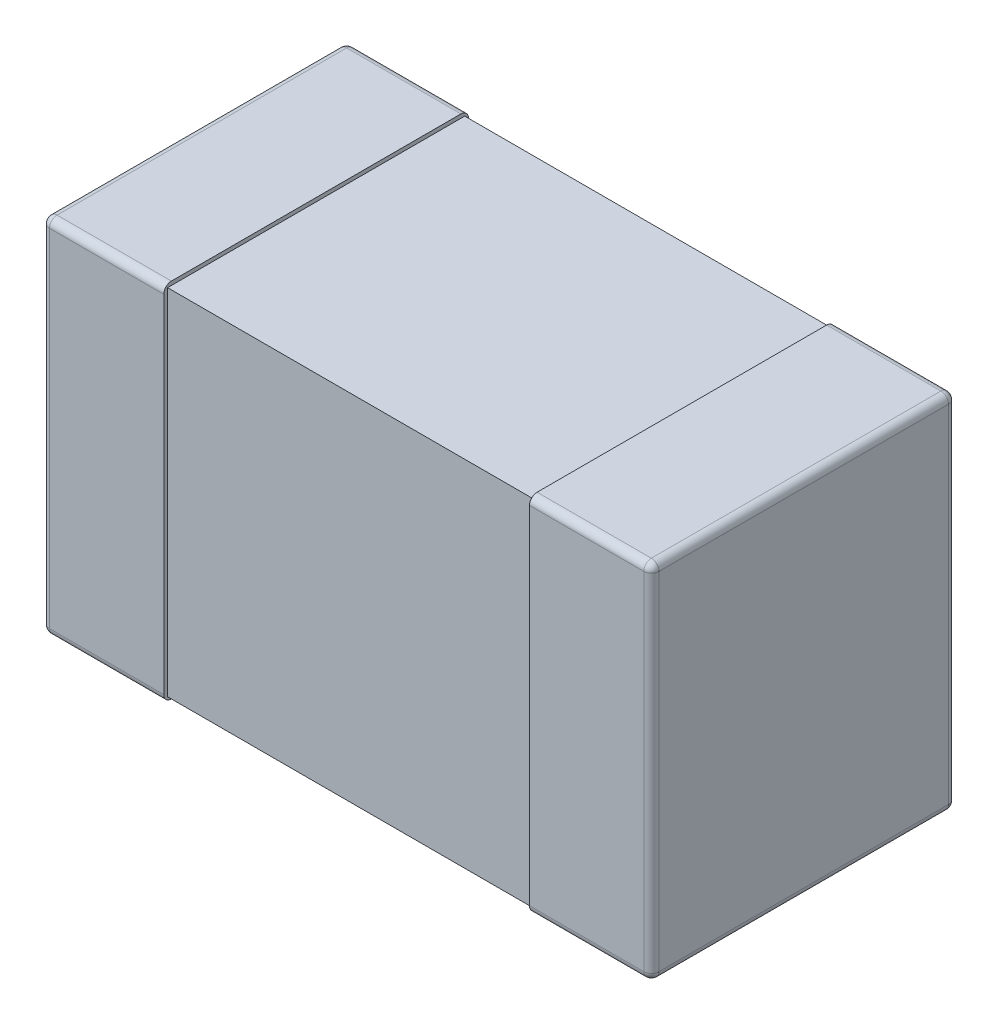
ISO-10303-21;
HEADER;
FILE_DESCRIPTION(('STEP AP214'),'2;1');
FILE_NAME('part.step','',(''),(''),'','','');
FILE_SCHEMA(('AUTOMOTIVE_DESIGN { 1 0 10303 214 1 1 1 1 }'));
ENDSEC;
DATA;
#1=APPLICATION_CONTEXT('core data for automotive mechanical design processes');
#2=APPLICATION_PROTOCOL_DEFINITION('international standard','automotive_design',2000,#1);
#3=PRODUCT_CONTEXT('',#1,'mechanical');
#4=PRODUCT('Part','Part','',(#3));
#5=PRODUCT_RELATED_PRODUCT_CATEGORY('part','',(#4));
#6=PRODUCT_DEFINITION_FORMATION('','',#4);
#7=PRODUCT_DEFINITION_CONTEXT('part definition',#1,'design');
#8=PRODUCT_DEFINITION('design','',#6,#7);
#9=PRODUCT_DEFINITION_SHAPE('','',#8);
#10=(LENGTH_UNIT() NAMED_UNIT(*) SI_UNIT(.MILLI.,.METRE.));
#11=(NAMED_UNIT(*) PLANE_ANGLE_UNIT() SI_UNIT($,.RADIAN.));
#12=(NAMED_UNIT(*) SI_UNIT($,.STERADIAN.) SOLID_ANGLE_UNIT());
#13=UNCERTAINTY_MEASURE_WITH_UNIT(LENGTH_MEASURE(1.E-05),#10,'distance_accuracy_value','');
#14=(GEOMETRIC_REPRESENTATION_CONTEXT(3) GLOBAL_UNCERTAINTY_ASSIGNED_CONTEXT((#13)) GLOBAL_UNIT_ASSIGNED_CONTEXT((#10,
#11,#12)) REPRESENTATION_CONTEXT('',''));
#15=CARTESIAN_POINT('',(0.,0.,0.));
#16=DIRECTION('',(0.,0.,1.));
#17=DIRECTION('',(1.,0.,0.));
#18=AXIS2_PLACEMENT_3D('',#15,#16,#17);
#19=CARTESIAN_POINT('',(0.8,0.95,0.4));
#20=DIRECTION('',(-1.,0.,0.));
#21=DIRECTION('',(0.,0.,1.));
#22=AXIS2_PLACEMENT_3D('',#19,#20,#21);
#23=PLANE('',#22);
#24=DIRECTION('',(0.,1.,0.));
#25=VECTOR('',#24,1.);
#26=CARTESIAN_POINT('',(0.8,0.95,-0.38));
#27=LINE('',#26,#25);
#28=CARTESIAN_POINT('',(0.8,0.93,-0.38));
#29=VERTEX_POINT('',#28);
#30=CARTESIAN_POINT('',(0.8,0.02,-0.38));
#31=VERTEX_POINT('',#30);
#32=EDGE_CURVE('E690',#29,#31,#27,.F.);
#33=ORIENTED_EDGE('',*,*,#32,.F.);
#34=DIRECTION('',(0.,0.,1.));
#35=VECTOR('',#34,1.);
#36=CARTESIAN_POINT('',(0.8,0.93,0.));
#37=LINE('',#36,#35);
#38=CARTESIAN_POINT('',(0.8,0.93,0.38));
#39=VERTEX_POINT('',#38);
#40=EDGE_CURVE('E415',#39,#29,#37,.F.);
#41=ORIENTED_EDGE('',*,*,#40,.F.);
#42=DIRECTION('',(0.,-1.,0.));
#43=VECTOR('',#42,1.);
#44=CARTESIAN_POINT('',(0.8,0.95,0.38));
#45=LINE('',#44,#43);
#46=CARTESIAN_POINT('',(0.8,0.02,0.38));
#47=VERTEX_POINT('',#46);
#48=EDGE_CURVE('E698',#47,#39,#45,.F.);
#49=ORIENTED_EDGE('',*,*,#48,.F.);
#50=DIRECTION('',(0.,0.,-1.));
#51=VECTOR('',#50,1.);
#52=CARTESIAN_POINT('',(0.8,0.02,0.4));
#53=LINE('',#52,#51);
#54=EDGE_CURVE('E465',#31,#47,#53,.F.);
#55=ORIENTED_EDGE('',*,*,#54,.F.);
#56=EDGE_LOOP('',(#33,#41,#49,#55));
#57=FACE_BOUND('',#56,.T.);
#58=ADVANCED_FACE('F17',(#57),#23,.F.);
#59=CARTESIAN_POINT('',(-0.8,0.95,0.));
#60=DIRECTION('',(-1.,0.,0.));
#61=DIRECTION('',(0.,0.,1.));
#62=AXIS2_PLACEMENT_3D('',#59,#60,#61);
#63=PLANE('',#62);
#64=DIRECTION('',(0.,0.,-1.));
#65=VECTOR('',#64,1.);
#66=CARTESIAN_POINT('',(-0.8,0.93,0.));
#67=LINE('',#66,#65);
#68=CARTESIAN_POINT('',(-0.8,0.93,-0.38));
#69=VERTEX_POINT('',#68);
#70=CARTESIAN_POINT('',(-0.8,0.93,0.38));
#71=VERTEX_POINT('',#70);
#72=EDGE_CURVE('E409',#69,#71,#67,.F.);
#73=ORIENTED_EDGE('',*,*,#72,.F.);
#74=DIRECTION('',(0.,1.,0.));
#75=VECTOR('',#74,1.);
#76=CARTESIAN_POINT('',(-0.8,0.95,-0.38));
#77=LINE('',#76,#75);
#78=CARTESIAN_POINT('',(-0.8,0.02,-0.38));
#79=VERTEX_POINT('',#78);
#80=EDGE_CURVE('E357',#79,#69,#77,.T.);
#81=ORIENTED_EDGE('',*,*,#80,.F.);
#82=DIRECTION('',(0.,0.,1.));
#83=VECTOR('',#82,1.);
#84=CARTESIAN_POINT('',(-0.8,0.02,0.));
#85=LINE('',#84,#83);
#86=CARTESIAN_POINT('',(-0.8,0.02,0.38));
#87=VERTEX_POINT('',#86);
#88=EDGE_CURVE('E672',#87,#79,#85,.F.);
#89=ORIENTED_EDGE('',*,*,#88,.F.);
#90=DIRECTION('',(0.,-1.,0.));
#91=VECTOR('',#90,1.);
#92=CARTESIAN_POINT('',(-0.8,0.95,0.38));
#93=LINE('',#92,#91);
#94=EDGE_CURVE('E314',#71,#87,#93,.T.);
#95=ORIENTED_EDGE('',*,*,#94,.F.);
#96=EDGE_LOOP('',(#73,#81,#89,#95));
#97=FACE_BOUND('',#96,.T.);
#98=ADVANCED_FACE('F490',(#97),#63,.T.);
#99=CARTESIAN_POINT('',(0.78,0.95,-0.38));
#100=DIRECTION('',(0.,1.,0.));
#101=DIRECTION('',(0.,0.,1.));
#102=AXIS2_PLACEMENT_3D('',#99,#100,#101);
#103=CYLINDRICAL_SURFACE('',#102,0.02);
#104=CARTESIAN_POINT('',(0.78,0.02,-0.38));
#105=DIRECTION('',(0.,1.,0.));
#106=DIRECTION('',(1.,0.,0.));
#107=AXIS2_PLACEMENT_3D('',#104,#105,#106);
#108=CIRCLE('',#107,0.02);
#109=CARTESIAN_POINT('',(0.78,0.02,-0.4));
#110=VERTEX_POINT('',#109);
#111=EDGE_CURVE('E478',#110,#31,#108,.F.);
#112=ORIENTED_EDGE('',*,*,#111,.F.);
#113=DIRECTION('',(0.,1.,0.));
#114=VECTOR('',#113,1.);
#115=CARTESIAN_POINT('',(0.78,0.95,-0.4));
#116=LINE('',#115,#114);
#117=CARTESIAN_POINT('',(0.78,0.93,-0.4));
#118=VERTEX_POINT('',#117);
#119=EDGE_CURVE('E296',#118,#110,#116,.F.);
#120=ORIENTED_EDGE('',*,*,#119,.F.);
#121=CARTESIAN_POINT('',(0.78,0.93,-0.38));
#122=DIRECTION('',(0.,1.,0.));
#123=DIRECTION('',(1.,0.,0.));
#124=AXIS2_PLACEMENT_3D('',#121,#122,#123);
#125=CIRCLE('',#124,0.02);
#126=EDGE_CURVE('E406',#29,#118,#125,.T.);
#127=ORIENTED_EDGE('',*,*,#126,.F.);
#128=ORIENTED_EDGE('',*,*,#32,.T.);
#129=EDGE_LOOP('',(#112,#120,#127,#128));
#130=FACE_BOUND('',#129,.T.);
#131=ADVANCED_FACE('F487',(#130),#103,.T.);
#132=CARTESIAN_POINT('',(0.78,0.02,-0.38));
#133=DIRECTION('',(1.,0.,0.));
#134=DIRECTION('',(0.,0.,-1.));
#135=AXIS2_PLACEMENT_3D('',#132,#133,#134);
#136=SPHERICAL_SURFACE('',#135,0.02);
#137=CARTESIAN_POINT('',(0.78,0.02,-0.38));
#138=DIRECTION('',(0.,0.,-1.));
#139=DIRECTION('',(-1.,0.,0.));
#140=AXIS2_PLACEMENT_3D('',#137,#138,#139);
#141=CIRCLE('',#140,0.02);
#142=CARTESIAN_POINT('',(0.78,0.,-0.38));
#143=VERTEX_POINT('',#142);
#144=EDGE_CURVE('E475',#143,#31,#141,.F.);
#145=ORIENTED_EDGE('',*,*,#144,.F.);
#146=CARTESIAN_POINT('',(0.78,0.02,-0.38));
#147=DIRECTION('',(-1.,0.,0.));
#148=DIRECTION('',(0.,0.,1.));
#149=AXIS2_PLACEMENT_3D('',#146,#147,#148);
#150=CIRCLE('',#149,0.02);
#151=EDGE_CURVE('E187',#110,#143,#150,.T.);
#152=ORIENTED_EDGE('',*,*,#151,.F.);
#153=ORIENTED_EDGE('',*,*,#111,.T.);
#154=EDGE_LOOP('',(#145,#152,#153));
#155=FACE_BOUND('',#154,.T.);
#156=ADVANCED_FACE('F484',(#155),#136,.T.);
#157=CARTESIAN_POINT('',(0.78,0.02,0.4));
#158=DIRECTION('',(0.,0.,-1.));
#159=DIRECTION('',(-1.,0.,0.));
#160=AXIS2_PLACEMENT_3D('',#157,#158,#159);
#161=CYLINDRICAL_SURFACE('',#160,0.02);
#162=ORIENTED_EDGE('',*,*,#144,.T.);
#163=ORIENTED_EDGE('',*,*,#54,.T.);
#164=CARTESIAN_POINT('',(0.78,0.02,0.38));
#165=DIRECTION('',(0.,0.,-1.));
#166=DIRECTION('',(1.,0.,0.));
#167=AXIS2_PLACEMENT_3D('',#164,#165,#166);
#168=CIRCLE('',#167,0.02);
#169=CARTESIAN_POINT('',(0.78,0.,0.38));
#170=VERTEX_POINT('',#169);
#171=EDGE_CURVE('E461',#170,#47,#168,.F.);
#172=ORIENTED_EDGE('',*,*,#171,.F.);
#173=DIRECTION('',(0.,0.,1.));
#174=VECTOR('',#173,1.);
#175=CARTESIAN_POINT('',(0.78,0.,0.));
#176=LINE('',#175,#174);
#177=EDGE_CURVE('E191',#170,#143,#176,.F.);
#178=ORIENTED_EDGE('',*,*,#177,.T.);
#179=EDGE_LOOP('',(#162,#163,#172,#178));
#180=FACE_BOUND('',#179,.T.);
#181=ADVANCED_FACE('F453',(#180),#161,.T.);
#182=CARTESIAN_POINT('',(0.78,0.02,0.38));
#183=DIRECTION('',(1.,0.,0.));
#184=DIRECTION('',(0.,0.,-1.));
#185=AXIS2_PLACEMENT_3D('',#182,#183,#184);
#186=SPHERICAL_SURFACE('',#185,0.02);
#187=CARTESIAN_POINT('',(0.78,0.02,0.38));
#188=DIRECTION('',(1.,0.,0.));
#189=DIRECTION('',(0.,0.,-1.));
#190=AXIS2_PLACEMENT_3D('',#187,#188,#189);
#191=CIRCLE('',#190,0.02);
#192=CARTESIAN_POINT('',(0.78,0.0200000000000001,0.4));
#193=VERTEX_POINT('',#192);
#194=EDGE_CURVE('E290',#170,#193,#191,.F.);
#195=ORIENTED_EDGE('',*,*,#194,.F.);
#196=ORIENTED_EDGE('',*,*,#171,.T.);
#197=CARTESIAN_POINT('',(0.78,0.0200000000000001,0.38));
#198=DIRECTION('',(0.,-1.,0.));
#199=DIRECTION('',(0.,0.,-1.));
#200=AXIS2_PLACEMENT_3D('',#197,#198,#199);
#201=CIRCLE('',#200,0.02);
#202=EDGE_CURVE('E464',#193,#47,#201,.F.);
#203=ORIENTED_EDGE('',*,*,#202,.F.);
#204=EDGE_LOOP('',(#195,#196,#203));
#205=FACE_BOUND('',#204,.T.);
#206=ADVANCED_FACE('F448',(#205),#186,.T.);
#207=CARTESIAN_POINT('',(0.78,0.95,0.38));
#208=DIRECTION('',(0.,-1.,0.));
#209=DIRECTION('',(0.,0.,-1.));
#210=AXIS2_PLACEMENT_3D('',#207,#208,#209);
#211=CYLINDRICAL_SURFACE('',#210,0.02);
#212=ORIENTED_EDGE('',*,*,#202,.T.);
#213=ORIENTED_EDGE('',*,*,#48,.T.);
#214=CARTESIAN_POINT('',(0.78,0.93,0.38));
#215=DIRECTION('',(0.,-1.,0.));
#216=DIRECTION('',(1.,0.,0.));
#217=AXIS2_PLACEMENT_3D('',#214,#215,#216);
#218=CIRCLE('',#217,0.02);
#219=CARTESIAN_POINT('',(0.78,0.93,0.4));
#220=VERTEX_POINT('',#219);
#221=EDGE_CURVE('E429',#220,#39,#218,.F.);
#222=ORIENTED_EDGE('',*,*,#221,.F.);
#223=DIRECTION('',(0.,1.,0.));
#224=VECTOR('',#223,1.);
#225=CARTESIAN_POINT('',(0.78,0.95,0.4));
#226=LINE('',#225,#224);
#227=EDGE_CURVE('E286',#220,#193,#226,.F.);
#228=ORIENTED_EDGE('',*,*,#227,.T.);
#229=EDGE_LOOP('',(#212,#213,#222,#228));
#230=FACE_BOUND('',#229,.T.);
#231=ADVANCED_FACE('F444',(#230),#211,.T.);
#232=CARTESIAN_POINT('',(0.78,0.93,0.38));
#233=DIRECTION('',(1.,0.,0.));
#234=DIRECTION('',(0.,0.,-1.));
#235=AXIS2_PLACEMENT_3D('',#232,#233,#234);
#236=SPHERICAL_SURFACE('',#235,0.02);
#237=CARTESIAN_POINT('',(0.78,0.93,0.38));
#238=DIRECTION('',(-1.,0.,0.));
#239=DIRECTION('',(0.,0.,1.));
#240=AXIS2_PLACEMENT_3D('',#237,#238,#239);
#241=CIRCLE('',#240,0.02);
#242=CARTESIAN_POINT('',(0.78,0.95,0.38));
#243=VERTEX_POINT('',#242);
#244=EDGE_CURVE('E281',#220,#243,#241,.T.);
#245=ORIENTED_EDGE('',*,*,#244,.F.);
#246=ORIENTED_EDGE('',*,*,#221,.T.);
#247=CARTESIAN_POINT('',(0.78,0.93,0.38));
#248=DIRECTION('',(0.,0.,1.));
#249=DIRECTION('',(1.,0.,0.));
#250=AXIS2_PLACEMENT_3D('',#247,#248,#249);
#251=CIRCLE('',#250,0.02);
#252=EDGE_CURVE('E426',#243,#39,#251,.F.);
#253=ORIENTED_EDGE('',*,*,#252,.F.);
#254=EDGE_LOOP('',(#245,#246,#253));
#255=FACE_BOUND('',#254,.T.);
#256=ADVANCED_FACE('F440',(#255),#236,.T.);
#257=CARTESIAN_POINT('',(0.78,0.93,0.));
#258=DIRECTION('',(0.,0.,1.));
#259=DIRECTION('',(1.,0.,0.));
#260=AXIS2_PLACEMENT_3D('',#257,#258,#259);
#261=CYLINDRICAL_SURFACE('',#260,0.02);
#262=CARTESIAN_POINT('',(0.78,0.93,-0.38));
#263=DIRECTION('',(0.,0.,1.));
#264=DIRECTION('',(1.,0.,0.));
#265=AXIS2_PLACEMENT_3D('',#262,#263,#264);
#266=CIRCLE('',#265,0.02);
#267=CARTESIAN_POINT('',(0.78,0.95,-0.38));
#268=VERTEX_POINT('',#267);
#269=EDGE_CURVE('E410',#268,#29,#266,.F.);
#270=ORIENTED_EDGE('',*,*,#269,.F.);
#271=DIRECTION('',(0.,0.,1.));
#272=VECTOR('',#271,1.);
#273=CARTESIAN_POINT('',(0.78,0.95,0.));
#274=LINE('',#273,#272);
#275=EDGE_CURVE('E275',#243,#268,#274,.F.);
#276=ORIENTED_EDGE('',*,*,#275,.F.);
#277=ORIENTED_EDGE('',*,*,#252,.T.);
#278=ORIENTED_EDGE('',*,*,#40,.T.);
#279=EDGE_LOOP('',(#270,#276,#277,#278));
#280=FACE_BOUND('',#279,.T.);
#281=ADVANCED_FACE('F443',(#280),#261,.T.);
#282=CARTESIAN_POINT('',(0.78,0.93,-0.38));
#283=DIRECTION('',(1.,0.,0.));
#284=DIRECTION('',(0.,0.,-1.));
#285=AXIS2_PLACEMENT_3D('',#282,#283,#284);
#286=SPHERICAL_SURFACE('',#285,0.02);
#287=ORIENTED_EDGE('',*,*,#269,.T.);
#288=ORIENTED_EDGE('',*,*,#126,.T.);
#289=CARTESIAN_POINT('',(0.78,0.93,-0.38));
#290=DIRECTION('',(1.,0.,0.));
#291=DIRECTION('',(0.,0.,-1.));
#292=AXIS2_PLACEMENT_3D('',#289,#290,#291);
#293=CIRCLE('',#292,0.02);
#294=EDGE_CURVE('E264',#268,#118,#293,.F.);
#295=ORIENTED_EDGE('',*,*,#294,.F.);
#296=EDGE_LOOP('',(#287,#288,#295));
#297=FACE_BOUND('',#296,.T.);
#298=ADVANCED_FACE('F389',(#297),#286,.T.);
#299=CARTESIAN_POINT('',(-0.78,0.93,0.38));
#300=DIRECTION('',(1.,0.,0.));
#301=DIRECTION('',(0.,0.,-1.));
#302=AXIS2_PLACEMENT_3D('',#299,#300,#301);
#303=SPHERICAL_SURFACE('',#302,0.02);
#304=CARTESIAN_POINT('',(-0.78,0.93,0.38));
#305=DIRECTION('',(0.,0.,-1.));
#306=DIRECTION('',(-1.,0.,0.));
#307=AXIS2_PLACEMENT_3D('',#304,#305,#306);
#308=CIRCLE('',#307,0.02);
#309=CARTESIAN_POINT('',(-0.78,0.95,0.38));
#310=VERTEX_POINT('',#309);
#311=EDGE_CURVE('E687',#71,#310,#308,.T.);
#312=ORIENTED_EDGE('',*,*,#311,.F.);
#313=CARTESIAN_POINT('',(-0.78,0.93,0.38));
#314=DIRECTION('',(0.,-1.,0.));
#315=DIRECTION('',(0.,0.,-1.));
#316=AXIS2_PLACEMENT_3D('',#313,#314,#315);
#317=CIRCLE('',#316,0.02);
#318=CARTESIAN_POINT('',(-0.78,0.93,0.4));
#319=VERTEX_POINT('',#318);
#320=EDGE_CURVE('E311',#319,#71,#317,.T.);
#321=ORIENTED_EDGE('',*,*,#320,.F.);
#322=CARTESIAN_POINT('',(-0.78,0.93,0.38));
#323=DIRECTION('',(-1.,0.,0.));
#324=DIRECTION('',(0.,0.,1.));
#325=AXIS2_PLACEMENT_3D('',#322,#323,#324);
#326=CIRCLE('',#325,0.02);
#327=EDGE_CURVE('E263',#310,#319,#326,.F.);
#328=ORIENTED_EDGE('',*,*,#327,.F.);
#329=EDGE_LOOP('',(#312,#321,#328));
#330=FACE_BOUND('',#329,.T.);
#331=ADVANCED_FACE('F384',(#330),#303,.T.);
#332=CARTESIAN_POINT('',(-0.78,0.93,0.));
#333=DIRECTION('',(0.,0.,-1.));
#334=DIRECTION('',(-1.,0.,0.));
#335=AXIS2_PLACEMENT_3D('',#332,#333,#334);
#336=CYLINDRICAL_SURFACE('',#335,0.02);
#337=ORIENTED_EDGE('',*,*,#311,.T.);
#338=DIRECTION('',(0.,0.,1.));
#339=VECTOR('',#338,1.);
#340=CARTESIAN_POINT('',(-0.78,0.95,0.));
#341=LINE('',#340,#339);
#342=CARTESIAN_POINT('',(-0.78,0.95,-0.380000000000024));
#343=VERTEX_POINT('',#342);
#344=EDGE_CURVE('E257',#343,#310,#341,.T.);
#345=ORIENTED_EDGE('',*,*,#344,.F.);
#346=CARTESIAN_POINT('',(-0.78,0.93,-0.38));
#347=DIRECTION('',(0.,4.79089562820243E-12,1.));
#348=DIRECTION('',(1.,0.,0.));
#349=AXIS2_PLACEMENT_3D('',#346,#347,#348);
#350=CIRCLE('',#349,0.02);
#351=EDGE_CURVE('E363',#69,#343,#350,.F.);
#352=ORIENTED_EDGE('',*,*,#351,.F.);
#353=ORIENTED_EDGE('',*,*,#72,.T.);
#354=EDGE_LOOP('',(#337,#345,#352,#353));
#355=FACE_BOUND('',#354,.T.);
#356=ADVANCED_FACE('F380',(#355),#336,.T.);
#357=CARTESIAN_POINT('',(-0.78,0.93,-0.38));
#358=DIRECTION('',(1.,0.,0.));
#359=DIRECTION('',(0.,0.,-1.));
#360=AXIS2_PLACEMENT_3D('',#357,#358,#359);
#361=SPHERICAL_SURFACE('',#360,0.02);
#362=CARTESIAN_POINT('',(-0.78,0.93,-0.38));
#363=DIRECTION('',(0.,1.,0.));
#364=DIRECTION('',(0.,0.,1.));
#365=AXIS2_PLACEMENT_3D('',#362,#363,#364);
#366=CIRCLE('',#365,0.02);
#367=CARTESIAN_POINT('',(-0.78,0.93,-0.4));
#368=VERTEX_POINT('',#367);
#369=EDGE_CURVE('E360',#69,#368,#366,.F.);
#370=ORIENTED_EDGE('',*,*,#369,.F.);
#371=ORIENTED_EDGE('',*,*,#351,.T.);
#372=CARTESIAN_POINT('',(-0.78,0.93,-0.38));
#373=DIRECTION('',(1.,0.,0.));
#374=DIRECTION('',(0.,0.,-1.));
#375=AXIS2_PLACEMENT_3D('',#372,#373,#374);
#376=CIRCLE('',#375,0.02);
#377=EDGE_CURVE('E251',#368,#343,#376,.T.);
#378=ORIENTED_EDGE('',*,*,#377,.F.);
#379=EDGE_LOOP('',(#370,#371,#378));
#380=FACE_BOUND('',#379,.T.);
#381=ADVANCED_FACE('F377',(#380),#361,.T.);
#382=CARTESIAN_POINT('',(-0.78,0.95,-0.38));
#383=DIRECTION('',(0.,1.,0.));
#384=DIRECTION('',(0.,0.,1.));
#385=AXIS2_PLACEMENT_3D('',#382,#383,#384);
#386=CYLINDRICAL_SURFACE('',#385,0.02);
#387=CARTESIAN_POINT('',(-0.78,0.02,-0.38));
#388=DIRECTION('',(0.,1.,0.));
#389=DIRECTION('',(1.,0.,0.));
#390=AXIS2_PLACEMENT_3D('',#387,#388,#389);
#391=CIRCLE('',#390,0.02);
#392=CARTESIAN_POINT('',(-0.78,0.02,-0.4));
#393=VERTEX_POINT('',#392);
#394=EDGE_CURVE('E353',#79,#393,#391,.F.);
#395=ORIENTED_EDGE('',*,*,#394,.F.);
#396=ORIENTED_EDGE('',*,*,#80,.T.);
#397=ORIENTED_EDGE('',*,*,#369,.T.);
#398=DIRECTION('',(0.,1.,0.));
#399=VECTOR('',#398,1.);
#400=CARTESIAN_POINT('',(-0.78,0.95,-0.4));
#401=LINE('',#400,#399);
#402=EDGE_CURVE('E245',#368,#393,#401,.F.);
#403=ORIENTED_EDGE('',*,*,#402,.T.);
#404=EDGE_LOOP('',(#395,#396,#397,#403));
#405=FACE_BOUND('',#404,.T.);
#406=ADVANCED_FACE('F345',(#405),#386,.T.);
#407=CARTESIAN_POINT('',(-0.78,0.02,-0.38));
#408=DIRECTION('',(1.,0.,0.));
#409=DIRECTION('',(0.,0.,-1.));
#410=AXIS2_PLACEMENT_3D('',#407,#408,#409);
#411=SPHERICAL_SURFACE('',#410,0.02);
#412=CARTESIAN_POINT('',(-0.78,0.02,-0.38));
#413=DIRECTION('',(-1.,0.,0.));
#414=DIRECTION('',(0.,0.,1.));
#415=AXIS2_PLACEMENT_3D('',#412,#413,#414);
#416=CIRCLE('',#415,0.02);
#417=CARTESIAN_POINT('',(-0.78,0.,-0.38));
#418=VERTEX_POINT('',#417);
#419=EDGE_CURVE('E239',#418,#393,#416,.F.);
#420=ORIENTED_EDGE('',*,*,#419,.F.);
#421=CARTESIAN_POINT('',(-0.78,0.02,-0.38));
#422=DIRECTION('',(0.,0.,1.));
#423=DIRECTION('',(1.,0.,0.));
#424=AXIS2_PLACEMENT_3D('',#421,#422,#423);
#425=CIRCLE('',#424,0.02);
#426=EDGE_CURVE('E356',#79,#418,#425,.T.);
#427=ORIENTED_EDGE('',*,*,#426,.F.);
#428=ORIENTED_EDGE('',*,*,#394,.T.);
#429=EDGE_LOOP('',(#420,#427,#428));
#430=FACE_BOUND('',#429,.T.);
#431=ADVANCED_FACE('F340',(#430),#411,.T.);
#432=CARTESIAN_POINT('',(-0.78,0.02,0.));
#433=DIRECTION('',(0.,0.,1.));
#434=DIRECTION('',(1.,0.,0.));
#435=AXIS2_PLACEMENT_3D('',#432,#433,#434);
#436=CYLINDRICAL_SURFACE('',#435,0.02);
#437=CARTESIAN_POINT('',(-0.78,0.02,0.38));
#438=DIRECTION('',(0.,-4.79101809288235E-12,-1.));
#439=DIRECTION('',(1.,0.,0.));
#440=AXIS2_PLACEMENT_3D('',#437,#438,#439);
#441=CIRCLE('',#440,0.02);
#442=CARTESIAN_POINT('',(-0.78,0.,0.380000000000024));
#443=VERTEX_POINT('',#442);
#444=EDGE_CURVE('E315',#87,#443,#441,.F.);
#445=ORIENTED_EDGE('',*,*,#444,.F.);
#446=ORIENTED_EDGE('',*,*,#88,.T.);
#447=ORIENTED_EDGE('',*,*,#426,.T.);
#448=DIRECTION('',(0.,0.,1.));
#449=VECTOR('',#448,1.);
#450=CARTESIAN_POINT('',(-0.78,0.,0.));
#451=LINE('',#450,#449);
#452=EDGE_CURVE('E233',#418,#443,#451,.T.);
#453=ORIENTED_EDGE('',*,*,#452,.T.);
#454=EDGE_LOOP('',(#445,#446,#447,#453));
#455=FACE_BOUND('',#454,.T.);
#456=ADVANCED_FACE('F335',(#455),#436,.T.);
#457=CARTESIAN_POINT('',(-0.78,0.02,0.38));
#458=DIRECTION('',(1.,0.,0.));
#459=DIRECTION('',(0.,0.,-1.));
#460=AXIS2_PLACEMENT_3D('',#457,#458,#459);
#461=SPHERICAL_SURFACE('',#460,0.02);
#462=CARTESIAN_POINT('',(-0.78,0.02,0.38));
#463=DIRECTION('',(1.,0.,0.));
#464=DIRECTION('',(0.,0.,-1.));
#465=AXIS2_PLACEMENT_3D('',#462,#463,#464);
#466=CIRCLE('',#465,0.02);
#467=CARTESIAN_POINT('',(-0.78,0.0200000000000001,0.4));
#468=VERTEX_POINT('',#467);
#469=EDGE_CURVE('E227',#468,#443,#466,.T.);
#470=ORIENTED_EDGE('',*,*,#469,.F.);
#471=CARTESIAN_POINT('',(-0.78,0.0200000000000001,0.38));
#472=DIRECTION('',(0.,-1.,0.));
#473=DIRECTION('',(0.,0.,-1.));
#474=AXIS2_PLACEMENT_3D('',#471,#472,#473);
#475=CIRCLE('',#474,0.02);
#476=EDGE_CURVE('E318',#87,#468,#475,.F.);
#477=ORIENTED_EDGE('',*,*,#476,.F.);
#478=ORIENTED_EDGE('',*,*,#444,.T.);
#479=EDGE_LOOP('',(#470,#477,#478));
#480=FACE_BOUND('',#479,.T.);
#481=ADVANCED_FACE('F330',(#480),#461,.T.);
#482=CARTESIAN_POINT('',(-0.78,0.95,0.38));
#483=DIRECTION('',(0.,-1.,0.));
#484=DIRECTION('',(0.,0.,-1.));
#485=AXIS2_PLACEMENT_3D('',#482,#483,#484);
#486=CYLINDRICAL_SURFACE('',#485,0.02);
#487=ORIENTED_EDGE('',*,*,#476,.T.);
#488=DIRECTION('',(0.,1.,0.));
#489=VECTOR('',#488,1.);
#490=CARTESIAN_POINT('',(-0.78,0.95,0.4));
#491=LINE('',#490,#489);
#492=EDGE_CURVE('E217',#319,#468,#491,.F.);
#493=ORIENTED_EDGE('',*,*,#492,.F.);
#494=ORIENTED_EDGE('',*,*,#320,.T.);
#495=ORIENTED_EDGE('',*,*,#94,.T.);
#496=EDGE_LOOP('',(#487,#493,#494,#495));
#497=FACE_BOUND('',#496,.T.);
#498=ADVANCED_FACE('F334',(#497),#486,.T.);
#499=CARTESIAN_POINT('',(0.48,0.95,-0.4));
#500=DIRECTION('',(0.,0.,-1.));
#501=DIRECTION('',(-1.,0.,0.));
#502=AXIS2_PLACEMENT_3D('',#499,#500,#501);
#503=PLANE('',#502);
#504=DIRECTION('',(0.,1.,0.));
#505=VECTOR('',#504,1.);
#506=CARTESIAN_POINT('',(0.48,0.95,-0.4));
#507=LINE('',#506,#505);
#508=CARTESIAN_POINT('',(0.48,0.93,-0.4));
#509=VERTEX_POINT('',#508);
#510=CARTESIAN_POINT('',(0.48,0.02,-0.4));
#511=VERTEX_POINT('',#510);
#512=EDGE_CURVE('E206',#509,#511,#507,.F.);
#513=ORIENTED_EDGE('',*,*,#512,.F.);
#514=DIRECTION('',(1.,0.,0.));
#515=VECTOR('',#514,1.);
#516=CARTESIAN_POINT('',(0.48,0.93,-0.4));
#517=LINE('',#516,#515);
#518=EDGE_CURVE('E260',#118,#509,#517,.F.);
#519=ORIENTED_EDGE('',*,*,#518,.F.);
#520=ORIENTED_EDGE('',*,*,#119,.T.);
#521=DIRECTION('',(-1.,0.,0.));
#522=VECTOR('',#521,1.);
#523=CARTESIAN_POINT('',(0.,0.02,-0.4));
#524=LINE('',#523,#522);
#525=EDGE_CURVE('E175',#511,#110,#524,.F.);
#526=ORIENTED_EDGE('',*,*,#525,.F.);
#527=EDGE_LOOP('',(#513,#519,#520,#526));
#528=FACE_BOUND('',#527,.T.);
#529=ADVANCED_FACE('F580',(#528),#503,.T.);
#530=CARTESIAN_POINT('',(0.,0.02,-0.38));
#531=DIRECTION('',(-1.,0.,0.));
#532=DIRECTION('',(0.,0.,1.));
#533=AXIS2_PLACEMENT_3D('',#530,#531,#532);
#534=CYLINDRICAL_SURFACE('',#533,0.02);
#535=ORIENTED_EDGE('',*,*,#151,.T.);
#536=DIRECTION('',(1.,0.,0.));
#537=VECTOR('',#536,1.);
#538=CARTESIAN_POINT('',(0.,0.,-0.38));
#539=LINE('',#538,#537);
#540=CARTESIAN_POINT('',(0.48,0.,-0.38));
#541=VERTEX_POINT('',#540);
#542=EDGE_CURVE('E181',#143,#541,#539,.F.);
#543=ORIENTED_EDGE('',*,*,#542,.T.);
#544=CARTESIAN_POINT('',(0.48,0.02,-0.38));
#545=DIRECTION('',(-1.,0.,0.));
#546=DIRECTION('',(0.,0.,1.));
#547=AXIS2_PLACEMENT_3D('',#544,#545,#546);
#548=CIRCLE('',#547,0.02);
#549=EDGE_CURVE('E20',#511,#541,#548,.T.);
#550=ORIENTED_EDGE('',*,*,#549,.F.);
#551=ORIENTED_EDGE('',*,*,#525,.T.);
#552=EDGE_LOOP('',(#535,#543,#550,#551));
#553=FACE_BOUND('',#552,.T.);
#554=ADVANCED_FACE('F183',(#553),#534,.T.);
#555=CARTESIAN_POINT('',(0.,0.,0.));
#556=DIRECTION('',(0.,1.,0.));
#557=DIRECTION('',(0.,0.,1.));
#558=AXIS2_PLACEMENT_3D('',#555,#556,#557);
#559=PLANE('',#558);
#560=ORIENTED_EDGE('',*,*,#542,.F.);
#561=ORIENTED_EDGE('',*,*,#177,.F.);
#562=DIRECTION('',(1.,0.,0.));
#563=VECTOR('',#562,1.);
#564=CARTESIAN_POINT('',(0.48,0.,0.38));
#565=LINE('',#564,#563);
#566=CARTESIAN_POINT('',(0.48,0.,0.38));
#567=VERTEX_POINT('',#566);
#568=EDGE_CURVE('E190',#567,#170,#565,.T.);
#569=ORIENTED_EDGE('',*,*,#568,.F.);
#570=DIRECTION('',(0.,0.,1.));
#571=VECTOR('',#570,1.);
#572=CARTESIAN_POINT('',(0.48,0.,0.4));
#573=LINE('',#572,#571);
#574=EDGE_CURVE('E194',#541,#567,#573,.T.);
#575=ORIENTED_EDGE('',*,*,#574,.F.);
#576=EDGE_LOOP('',(#560,#561,#569,#575));
#577=FACE_BOUND('',#576,.T.);
#578=ADVANCED_FACE('F195',(#577),#559,.F.);
#579=CARTESIAN_POINT('',(0.48,0.02,0.38));
#580=DIRECTION('',(1.,0.,0.));
#581=DIRECTION('',(0.,0.,-1.));
#582=AXIS2_PLACEMENT_3D('',#579,#580,#581);
#583=CYLINDRICAL_SURFACE('',#582,0.02);
#584=ORIENTED_EDGE('',*,*,#194,.T.);
#585=DIRECTION('',(-1.,0.,0.));
#586=VECTOR('',#585,1.);
#587=CARTESIAN_POINT('',(0.48,0.0200000000000001,0.4));
#588=LINE('',#587,#586);
#589=CARTESIAN_POINT('',(0.48,0.02,0.4));
#590=VERTEX_POINT('',#589);
#591=EDGE_CURVE('E284',#193,#590,#588,.T.);
#592=ORIENTED_EDGE('',*,*,#591,.T.);
#593=CARTESIAN_POINT('',(0.48,0.02,0.38));
#594=DIRECTION('',(1.,0.,0.));
#595=DIRECTION('',(0.,0.,-1.));
#596=AXIS2_PLACEMENT_3D('',#593,#594,#595);
#597=CIRCLE('',#596,0.02);
#598=EDGE_CURVE('E200',#567,#590,#597,.F.);
#599=ORIENTED_EDGE('',*,*,#598,.F.);
#600=ORIENTED_EDGE('',*,*,#568,.T.);
#601=EDGE_LOOP('',(#584,#592,#599,#600));
#602=FACE_BOUND('',#601,.T.);
#603=ADVANCED_FACE('F572',(#602),#583,.T.);
#604=CARTESIAN_POINT('',(0.48,0.95,0.4));
#605=DIRECTION('',(0.,0.,-1.));
#606=DIRECTION('',(-1.,0.,0.));
#607=AXIS2_PLACEMENT_3D('',#604,#605,#606);
#608=PLANE('',#607);
#609=ORIENTED_EDGE('',*,*,#591,.F.);
#610=ORIENTED_EDGE('',*,*,#227,.F.);
#611=DIRECTION('',(-1.,0.,0.));
#612=VECTOR('',#611,1.);
#613=CARTESIAN_POINT('',(0.,0.93,0.4));
#614=LINE('',#613,#612);
#615=CARTESIAN_POINT('',(0.48,0.93,0.4));
#616=VERTEX_POINT('',#615);
#617=EDGE_CURVE('E278',#616,#220,#614,.F.);
#618=ORIENTED_EDGE('',*,*,#617,.F.);
#619=DIRECTION('',(0.,1.,0.));
#620=VECTOR('',#619,1.);
#621=CARTESIAN_POINT('',(0.48,0.95,0.4));
#622=LINE('',#621,#620);
#623=EDGE_CURVE('E603',#590,#616,#622,.T.);
#624=ORIENTED_EDGE('',*,*,#623,.F.);
#625=EDGE_LOOP('',(#609,#610,#618,#624));
#626=FACE_BOUND('',#625,.T.);
#627=ADVANCED_FACE('F568',(#626),#608,.F.);
#628=CARTESIAN_POINT('',(0.,0.93,0.38));
#629=DIRECTION('',(-1.,0.,0.));
#630=DIRECTION('',(0.,0.,1.));
#631=AXIS2_PLACEMENT_3D('',#628,#629,#630);
#632=CYLINDRICAL_SURFACE('',#631,0.02);
#633=CARTESIAN_POINT('',(0.48,0.93,0.38));
#634=DIRECTION('',(-1.,0.,0.));
#635=DIRECTION('',(0.,0.,1.));
#636=AXIS2_PLACEMENT_3D('',#633,#634,#635);
#637=CIRCLE('',#636,0.02);
#638=CARTESIAN_POINT('',(0.48,0.95,0.38));
#639=VERTEX_POINT('',#638);
#640=EDGE_CURVE('E597',#616,#639,#637,.T.);
#641=ORIENTED_EDGE('',*,*,#640,.F.);
#642=ORIENTED_EDGE('',*,*,#617,.T.);
#643=ORIENTED_EDGE('',*,*,#244,.T.);
#644=DIRECTION('',(1.,0.,0.));
#645=VECTOR('',#644,1.);
#646=CARTESIAN_POINT('',(0.,0.95,0.38));
#647=LINE('',#646,#645);
#648=EDGE_CURVE('E270',#639,#243,#647,.T.);
#649=ORIENTED_EDGE('',*,*,#648,.F.);
#650=EDGE_LOOP('',(#641,#642,#643,#649));
#651=FACE_BOUND('',#650,.T.);
#652=ADVANCED_FACE('F564',(#651),#632,.T.);
#653=CARTESIAN_POINT('',(0.,0.95,0.));
#654=DIRECTION('',(0.,1.,0.));
#655=DIRECTION('',(0.,0.,1.));
#656=AXIS2_PLACEMENT_3D('',#653,#654,#655);
#657=PLANE('',#656);
#658=DIRECTION('',(0.,0.,1.));
#659=VECTOR('',#658,1.);
#660=CARTESIAN_POINT('',(0.48,0.95,0.4));
#661=LINE('',#660,#659);
#662=CARTESIAN_POINT('',(0.48,0.95,-0.38));
#663=VERTEX_POINT('',#662);
#664=EDGE_CURVE('E592',#639,#663,#661,.F.);
#665=ORIENTED_EDGE('',*,*,#664,.F.);
#666=ORIENTED_EDGE('',*,*,#648,.T.);
#667=ORIENTED_EDGE('',*,*,#275,.T.);
#668=DIRECTION('',(1.,0.,0.));
#669=VECTOR('',#668,1.);
#670=CARTESIAN_POINT('',(0.48,0.95,-0.38));
#671=LINE('',#670,#669);
#672=EDGE_CURVE('E267',#663,#268,#671,.T.);
#673=ORIENTED_EDGE('',*,*,#672,.F.);
#674=EDGE_LOOP('',(#665,#666,#667,#673));
#675=FACE_BOUND('',#674,.T.);
#676=ADVANCED_FACE('F560',(#675),#657,.T.);
#677=CARTESIAN_POINT('',(0.48,0.93,-0.38));
#678=DIRECTION('',(1.,0.,0.));
#679=DIRECTION('',(0.,0.,-1.));
#680=AXIS2_PLACEMENT_3D('',#677,#678,#679);
#681=CYLINDRICAL_SURFACE('',#680,0.02);
#682=ORIENTED_EDGE('',*,*,#294,.T.);
#683=ORIENTED_EDGE('',*,*,#518,.T.);
#684=CARTESIAN_POINT('',(0.48,0.93,-0.38));
#685=DIRECTION('',(1.,0.,0.));
#686=DIRECTION('',(0.,0.,-1.));
#687=AXIS2_PLACEMENT_3D('',#684,#685,#686);
#688=CIRCLE('',#687,0.02);
#689=EDGE_CURVE('E588',#663,#509,#688,.F.);
#690=ORIENTED_EDGE('',*,*,#689,.F.);
#691=ORIENTED_EDGE('',*,*,#672,.T.);
#692=EDGE_LOOP('',(#682,#683,#690,#691));
#693=FACE_BOUND('',#692,.T.);
#694=ADVANCED_FACE('F556',(#693),#681,.T.);
#695=CARTESIAN_POINT('',(0.,0.93,0.38));
#696=DIRECTION('',(-1.,0.,0.));
#697=DIRECTION('',(0.,0.,1.));
#698=AXIS2_PLACEMENT_3D('',#695,#696,#697);
#699=CYLINDRICAL_SURFACE('',#698,0.02);
#700=ORIENTED_EDGE('',*,*,#327,.T.);
#701=DIRECTION('',(1.,0.,0.));
#702=VECTOR('',#701,1.);
#703=CARTESIAN_POINT('',(0.,0.93,0.4));
#704=LINE('',#703,#702);
#705=CARTESIAN_POINT('',(-0.48,0.93,0.4));
#706=VERTEX_POINT('',#705);
#707=EDGE_CURVE('E210',#706,#319,#704,.F.);
#708=ORIENTED_EDGE('',*,*,#707,.F.);
#709=CARTESIAN_POINT('',(-0.48,0.93,0.38));
#710=DIRECTION('',(-1.,0.,0.));
#711=DIRECTION('',(0.,0.,1.));
#712=AXIS2_PLACEMENT_3D('',#709,#710,#711);
#713=CIRCLE('',#712,0.02);
#714=CARTESIAN_POINT('',(-0.48,0.95,0.38));
#715=VERTEX_POINT('',#714);
#716=EDGE_CURVE('E601',#706,#715,#713,.T.);
#717=ORIENTED_EDGE('',*,*,#716,.T.);
#718=DIRECTION('',(1.,0.,0.));
#719=VECTOR('',#718,1.);
#720=CARTESIAN_POINT('',(0.,0.95,0.38));
#721=LINE('',#720,#719);
#722=EDGE_CURVE('E254',#310,#715,#721,.T.);
#723=ORIENTED_EDGE('',*,*,#722,.F.);
#724=EDGE_LOOP('',(#700,#708,#717,#723));
#725=FACE_BOUND('',#724,.T.);
#726=ADVANCED_FACE('F552',(#725),#699,.T.);
#727=CARTESIAN_POINT('',(0.,0.95,0.));
#728=DIRECTION('',(0.,1.,0.));
#729=DIRECTION('',(0.,0.,1.));
#730=AXIS2_PLACEMENT_3D('',#727,#728,#729);
#731=PLANE('',#730);
#732=ORIENTED_EDGE('',*,*,#344,.T.);
#733=ORIENTED_EDGE('',*,*,#722,.T.);
#734=DIRECTION('',(0.,0.,1.));
#735=VECTOR('',#734,1.);
#736=CARTESIAN_POINT('',(-0.48,0.95,0.));
#737=LINE('',#736,#735);
#738=CARTESIAN_POINT('',(-0.48,0.95,-0.38));
#739=VERTEX_POINT('',#738);
#740=EDGE_CURVE('E612',#715,#739,#737,.F.);
#741=ORIENTED_EDGE('',*,*,#740,.T.);
#742=DIRECTION('',(1.,0.,0.));
#743=VECTOR('',#742,1.);
#744=CARTESIAN_POINT('',(0.,0.95,-0.38));
#745=LINE('',#744,#743);
#746=EDGE_CURVE('E246',#343,#739,#745,.T.);
#747=ORIENTED_EDGE('',*,*,#746,.F.);
#748=EDGE_LOOP('',(#732,#733,#741,#747));
#749=FACE_BOUND('',#748,.T.);
#750=ADVANCED_FACE('F548',(#749),#731,.T.);
#751=CARTESIAN_POINT('',(0.,0.93,-0.38));
#752=DIRECTION('',(1.,0.,0.));
#753=DIRECTION('',(0.,0.,-1.));
#754=AXIS2_PLACEMENT_3D('',#751,#752,#753);
#755=CYLINDRICAL_SURFACE('',#754,0.02);
#756=ORIENTED_EDGE('',*,*,#377,.T.);
#757=ORIENTED_EDGE('',*,*,#746,.T.);
#758=CARTESIAN_POINT('',(-0.48,0.93,-0.38));
#759=DIRECTION('',(1.,0.,0.));
#760=DIRECTION('',(0.,0.,-1.));
#761=AXIS2_PLACEMENT_3D('',#758,#759,#760);
#762=CIRCLE('',#761,0.02);
#763=CARTESIAN_POINT('',(-0.48,0.93,-0.4));
#764=VERTEX_POINT('',#763);
#765=EDGE_CURVE('E614',#739,#764,#762,.F.);
#766=ORIENTED_EDGE('',*,*,#765,.T.);
#767=DIRECTION('',(1.,0.,0.));
#768=VECTOR('',#767,1.);
#769=CARTESIAN_POINT('',(0.,0.93,-0.4));
#770=LINE('',#769,#768);
#771=EDGE_CURVE('E242',#764,#368,#770,.F.);
#772=ORIENTED_EDGE('',*,*,#771,.T.);
#773=EDGE_LOOP('',(#756,#757,#766,#772));
#774=FACE_BOUND('',#773,.T.);
#775=ADVANCED_FACE('F544',(#774),#755,.T.);
#776=CARTESIAN_POINT('',(0.,0.95,-0.4));
#777=DIRECTION('',(0.,0.,1.));
#778=DIRECTION('',(1.,0.,0.));
#779=AXIS2_PLACEMENT_3D('',#776,#777,#778);
#780=PLANE('',#779);
#781=DIRECTION('',(-1.,0.,0.));
#782=VECTOR('',#781,1.);
#783=CARTESIAN_POINT('',(0.,0.02,-0.4));
#784=LINE('',#783,#782);
#785=CARTESIAN_POINT('',(-0.48,0.02,-0.4));
#786=VERTEX_POINT('',#785);
#787=EDGE_CURVE('E234',#393,#786,#784,.F.);
#788=ORIENTED_EDGE('',*,*,#787,.F.);
#789=ORIENTED_EDGE('',*,*,#402,.F.);
#790=ORIENTED_EDGE('',*,*,#771,.F.);
#791=DIRECTION('',(0.,1.,0.));
#792=VECTOR('',#791,1.);
#793=CARTESIAN_POINT('',(-0.48,0.95,-0.4));
#794=LINE('',#793,#792);
#795=EDGE_CURVE('E615',#764,#786,#794,.F.);
#796=ORIENTED_EDGE('',*,*,#795,.T.);
#797=EDGE_LOOP('',(#788,#789,#790,#796));
#798=FACE_BOUND('',#797,.T.);
#799=ADVANCED_FACE('F540',(#798),#780,.F.);
#800=CARTESIAN_POINT('',(0.,0.02,-0.38));
#801=DIRECTION('',(-1.,0.,0.));
#802=DIRECTION('',(0.,0.,1.));
#803=AXIS2_PLACEMENT_3D('',#800,#801,#802);
#804=CYLINDRICAL_SURFACE('',#803,0.02);
#805=ORIENTED_EDGE('',*,*,#419,.T.);
#806=ORIENTED_EDGE('',*,*,#787,.T.);
#807=CARTESIAN_POINT('',(-0.48,0.02,-0.38));
#808=DIRECTION('',(-1.,0.,0.));
#809=DIRECTION('',(0.,0.,1.));
#810=AXIS2_PLACEMENT_3D('',#807,#808,#809);
#811=CIRCLE('',#810,0.02);
#812=CARTESIAN_POINT('',(-0.48,0.,-0.38));
#813=VERTEX_POINT('',#812);
#814=EDGE_CURVE('E617',#786,#813,#811,.T.);
#815=ORIENTED_EDGE('',*,*,#814,.T.);
#816=DIRECTION('',(1.,0.,0.));
#817=VECTOR('',#816,1.);
#818=CARTESIAN_POINT('',(0.,0.,-0.38));
#819=LINE('',#818,#817);
#820=EDGE_CURVE('E230',#813,#418,#819,.F.);
#821=ORIENTED_EDGE('',*,*,#820,.T.);
#822=EDGE_LOOP('',(#805,#806,#815,#821));
#823=FACE_BOUND('',#822,.T.);
#824=ADVANCED_FACE('F536',(#823),#804,.T.);
#825=CARTESIAN_POINT('',(0.,0.,0.));
#826=DIRECTION('',(0.,1.,0.));
#827=DIRECTION('',(0.,0.,1.));
#828=AXIS2_PLACEMENT_3D('',#825,#826,#827);
#829=PLANE('',#828);
#830=DIRECTION('',(1.,0.,0.));
#831=VECTOR('',#830,1.);
#832=CARTESIAN_POINT('',(0.,0.,0.38));
#833=LINE('',#832,#831);
#834=CARTESIAN_POINT('',(-0.48,0.,0.38));
#835=VERTEX_POINT('',#834);
#836=EDGE_CURVE('E224',#443,#835,#833,.T.);
#837=ORIENTED_EDGE('',*,*,#836,.F.);
#838=ORIENTED_EDGE('',*,*,#452,.F.);
#839=ORIENTED_EDGE('',*,*,#820,.F.);
#840=DIRECTION('',(0.,0.,1.));
#841=VECTOR('',#840,1.);
#842=CARTESIAN_POINT('',(-0.48,0.,0.));
#843=LINE('',#842,#841);
#844=EDGE_CURVE('E618',#813,#835,#843,.T.);
#845=ORIENTED_EDGE('',*,*,#844,.T.);
#846=EDGE_LOOP('',(#837,#838,#839,#845));
#847=FACE_BOUND('',#846,.T.);
#848=ADVANCED_FACE('F532',(#847),#829,.F.);
#849=CARTESIAN_POINT('',(0.,0.02,0.38));
#850=DIRECTION('',(1.,0.,0.));
#851=DIRECTION('',(0.,0.,-1.));
#852=AXIS2_PLACEMENT_3D('',#849,#850,#851);
#853=CYLINDRICAL_SURFACE('',#852,0.02);
#854=ORIENTED_EDGE('',*,*,#469,.T.);
#855=ORIENTED_EDGE('',*,*,#836,.T.);
#856=CARTESIAN_POINT('',(-0.48,0.02,0.38));
#857=DIRECTION('',(1.,0.,0.));
#858=DIRECTION('',(0.,0.,-1.));
#859=AXIS2_PLACEMENT_3D('',#856,#857,#858);
#860=CIRCLE('',#859,0.02);
#861=CARTESIAN_POINT('',(-0.48,0.02,0.4));
#862=VERTEX_POINT('',#861);
#863=EDGE_CURVE('E620',#835,#862,#860,.F.);
#864=ORIENTED_EDGE('',*,*,#863,.T.);
#865=DIRECTION('',(1.,0.,0.));
#866=VECTOR('',#865,1.);
#867=CARTESIAN_POINT('',(0.,0.0200000000000001,0.4));
#868=LINE('',#867,#866);
#869=EDGE_CURVE('E214',#468,#862,#868,.T.);
#870=ORIENTED_EDGE('',*,*,#869,.F.);
#871=EDGE_LOOP('',(#854,#855,#864,#870));
#872=FACE_BOUND('',#871,.T.);
#873=ADVANCED_FACE('F528',(#872),#853,.T.);
#874=CARTESIAN_POINT('',(0.,0.95,0.4));
#875=DIRECTION('',(0.,0.,1.));
#876=DIRECTION('',(1.,0.,0.));
#877=AXIS2_PLACEMENT_3D('',#874,#875,#876);
#878=PLANE('',#877);
#879=DIRECTION('',(0.,1.,0.));
#880=VECTOR('',#879,1.);
#881=CARTESIAN_POINT('',(-0.48,0.95,0.4));
#882=LINE('',#881,#880);
#883=EDGE_CURVE('E621',#862,#706,#882,.T.);
#884=ORIENTED_EDGE('',*,*,#883,.T.);
#885=ORIENTED_EDGE('',*,*,#707,.T.);
#886=ORIENTED_EDGE('',*,*,#492,.T.);
#887=ORIENTED_EDGE('',*,*,#869,.T.);
#888=EDGE_LOOP('',(#884,#885,#886,#887));
#889=FACE_BOUND('',#888,.T.);
#890=ADVANCED_FACE('F524',(#889),#878,.T.);
#891=CARTESIAN_POINT('',(0.,0.94,0.39));
#892=DIRECTION('',(0.,0.,-1.));
#893=DIRECTION('',(-1.,0.,0.));
#894=AXIS2_PLACEMENT_3D('',#891,#892,#893);
#895=PLANE('',#894);
#896=DIRECTION('',(0.,1.,0.));
#897=VECTOR('',#896,1.);
#898=CARTESIAN_POINT('',(0.48,0.95,0.39));
#899=LINE('',#898,#897);
#900=CARTESIAN_POINT('',(0.48,0.94,0.39));
#901=VERTEX_POINT('',#900);
#902=CARTESIAN_POINT('',(0.48,0.01,0.39));
#903=VERTEX_POINT('',#902);
#904=EDGE_CURVE('E207',#901,#903,#899,.F.);
#905=ORIENTED_EDGE('',*,*,#904,.F.);
#906=DIRECTION('',(1.,0.,0.));
#907=VECTOR('',#906,1.);
#908=CARTESIAN_POINT('',(0.,0.94,0.39));
#909=LINE('',#908,#907);
#910=CARTESIAN_POINT('',(-0.48,0.94,0.39));
#911=VERTEX_POINT('',#910);
#912=EDGE_CURVE('E628',#911,#901,#909,.T.);
#913=ORIENTED_EDGE('',*,*,#912,.F.);
#914=DIRECTION('',(0.,1.,0.));
#915=VECTOR('',#914,1.);
#916=CARTESIAN_POINT('',(-0.48,0.95,0.39));
#917=LINE('',#916,#915);
#918=CARTESIAN_POINT('',(-0.48,0.01,0.39));
#919=VERTEX_POINT('',#918);
#920=EDGE_CURVE('E608',#911,#919,#917,.F.);
#921=ORIENTED_EDGE('',*,*,#920,.T.);
#922=DIRECTION('',(1.,0.,0.));
#923=VECTOR('',#922,1.);
#924=CARTESIAN_POINT('',(0.,0.01,0.39));
#925=LINE('',#924,#923);
#926=EDGE_CURVE('E593',#919,#903,#925,.T.);
#927=ORIENTED_EDGE('',*,*,#926,.T.);
#928=EDGE_LOOP('',(#905,#913,#921,#927));
#929=FACE_BOUND('',#928,.T.);
#930=ADVANCED_FACE('F521',(#929),#895,.F.);
#931=CARTESIAN_POINT('',(0.48,0.95,0.4));
#932=DIRECTION('',(-1.,0.,0.));
#933=DIRECTION('',(0.,0.,1.));
#934=AXIS2_PLACEMENT_3D('',#931,#932,#933);
#935=PLANE('',#934);
#936=ORIENTED_EDGE('',*,*,#664,.T.);
#937=ORIENTED_EDGE('',*,*,#689,.T.);
#938=ORIENTED_EDGE('',*,*,#512,.T.);
#939=ORIENTED_EDGE('',*,*,#549,.T.);
#940=ORIENTED_EDGE('',*,*,#574,.T.);
#941=ORIENTED_EDGE('',*,*,#598,.T.);
#942=ORIENTED_EDGE('',*,*,#623,.T.);
#943=ORIENTED_EDGE('',*,*,#640,.T.);
#944=EDGE_LOOP('',(#936,#937,#938,#939,#940,#941,#942,#943));
#945=FACE_BOUND('',#944,.T.);
#946=ORIENTED_EDGE('',*,*,#904,.T.);
#947=DIRECTION('',(0.,0.,1.));
#948=VECTOR('',#947,1.);
#949=CARTESIAN_POINT('',(0.48,0.01,0.));
#950=LINE('',#949,#948);
#951=CARTESIAN_POINT('',(0.48,0.01,-0.39));
#952=VERTEX_POINT('',#951);
#953=EDGE_CURVE('E595',#903,#952,#950,.F.);
#954=ORIENTED_EDGE('',*,*,#953,.T.);
#955=DIRECTION('',(0.,1.,0.));
#956=VECTOR('',#955,1.);
#957=CARTESIAN_POINT('',(0.48,0.94,-0.39));
#958=LINE('',#957,#956);
#959=CARTESIAN_POINT('',(0.48,0.94,-0.39));
#960=VERTEX_POINT('',#959);
#961=EDGE_CURVE('E631',#960,#952,#958,.F.);
#962=ORIENTED_EDGE('',*,*,#961,.F.);
#963=DIRECTION('',(0.,0.,1.));
#964=VECTOR('',#963,1.);
#965=CARTESIAN_POINT('',(0.48,0.94,0.));
#966=LINE('',#965,#964);
#967=EDGE_CURVE('E624',#901,#960,#966,.F.);
#968=ORIENTED_EDGE('',*,*,#967,.F.);
#969=EDGE_LOOP('',(#946,#954,#962,#968));
#970=FACE_BOUND('',#969,.T.);
#971=ADVANCED_FACE('F203',(#945,#970),#935,.T.);
#972=CARTESIAN_POINT('',(0.,0.01,0.));
#973=DIRECTION('',(0.,1.,0.));
#974=DIRECTION('',(0.,0.,1.));
#975=AXIS2_PLACEMENT_3D('',#972,#973,#974);
#976=PLANE('',#975);
#977=ORIENTED_EDGE('',*,*,#953,.F.);
#978=ORIENTED_EDGE('',*,*,#926,.F.);
#979=DIRECTION('',(0.,0.,1.));
#980=VECTOR('',#979,1.);
#981=CARTESIAN_POINT('',(-0.48,0.01,0.));
#982=LINE('',#981,#980);
#983=CARTESIAN_POINT('',(-0.48,0.01,-0.39));
#984=VERTEX_POINT('',#983);
#985=EDGE_CURVE('E610',#919,#984,#982,.F.);
#986=ORIENTED_EDGE('',*,*,#985,.T.);
#987=DIRECTION('',(-1.,0.,0.));
#988=VECTOR('',#987,1.);
#989=CARTESIAN_POINT('',(0.,0.01,-0.39));
#990=LINE('',#989,#988);
#991=EDGE_CURVE('E634',#952,#984,#990,.T.);
#992=ORIENTED_EDGE('',*,*,#991,.F.);
#993=EDGE_LOOP('',(#977,#978,#986,#992));
#994=FACE_BOUND('',#993,.T.);
#995=ADVANCED_FACE('F514',(#994),#976,.F.);
#996=CARTESIAN_POINT('',(-0.48,0.95,0.));
#997=DIRECTION('',(-1.,0.,0.));
#998=DIRECTION('',(0.,0.,1.));
#999=AXIS2_PLACEMENT_3D('',#996,#997,#998);
#1000=PLANE('',#999);
#1001=ORIENTED_EDGE('',*,*,#863,.F.);
#1002=ORIENTED_EDGE('',*,*,#844,.F.);
#1003=ORIENTED_EDGE('',*,*,#814,.F.);
#1004=ORIENTED_EDGE('',*,*,#795,.F.);
#1005=ORIENTED_EDGE('',*,*,#765,.F.);
#1006=ORIENTED_EDGE('',*,*,#740,.F.);
#1007=ORIENTED_EDGE('',*,*,#716,.F.);
#1008=ORIENTED_EDGE('',*,*,#883,.F.);
#1009=EDGE_LOOP('',(#1001,#1002,#1003,#1004,#1005,#1006,#1007,#1008));
#1010=FACE_BOUND('',#1009,.T.);
#1011=DIRECTION('',(0.,1.,0.));
#1012=VECTOR('',#1011,1.);
#1013=CARTESIAN_POINT('',(-0.48,0.94,-0.39));
#1014=LINE('',#1013,#1012);
#1015=CARTESIAN_POINT('',(-0.48,0.94,-0.39));
#1016=VERTEX_POINT('',#1015);
#1017=EDGE_CURVE('E26',#984,#1016,#1014,.T.);
#1018=ORIENTED_EDGE('',*,*,#1017,.F.);
#1019=ORIENTED_EDGE('',*,*,#985,.F.);
#1020=ORIENTED_EDGE('',*,*,#920,.F.);
#1021=DIRECTION('',(0.,0.,1.));
#1022=VECTOR('',#1021,1.);
#1023=CARTESIAN_POINT('',(-0.48,0.94,0.));
#1024=LINE('',#1023,#1022);
#1025=EDGE_CURVE('E35',#1016,#911,#1024,.T.);
#1026=ORIENTED_EDGE('',*,*,#1025,.F.);
#1027=EDGE_LOOP('',(#1018,#1019,#1020,#1026));
#1028=FACE_BOUND('',#1027,.T.);
#1029=ADVANCED_FACE('F507',(#1010,#1028),#1000,.F.);
#1030=CARTESIAN_POINT('',(0.,0.94,0.));
#1031=DIRECTION('',(0.,1.,0.));
#1032=DIRECTION('',(0.,0.,1.));
#1033=AXIS2_PLACEMENT_3D('',#1030,#1031,#1032);
#1034=PLANE('',#1033);
#1035=ORIENTED_EDGE('',*,*,#1025,.T.);
#1036=ORIENTED_EDGE('',*,*,#912,.T.);
#1037=ORIENTED_EDGE('',*,*,#967,.T.);
#1038=DIRECTION('',(-1.,0.,0.));
#1039=VECTOR('',#1038,1.);
#1040=CARTESIAN_POINT('',(0.,0.94,-0.39));
#1041=LINE('',#1040,#1039);
#1042=EDGE_CURVE('E11',#1016,#960,#1041,.F.);
#1043=ORIENTED_EDGE('',*,*,#1042,.F.);
#1044=EDGE_LOOP('',(#1035,#1036,#1037,#1043));
#1045=FACE_BOUND('',#1044,.T.);
#1046=ADVANCED_FACE('F501',(#1045),#1034,.T.);
#1047=CARTESIAN_POINT('',(0.,0.94,-0.39));
#1048=DIRECTION('',(0.,0.,-1.));
#1049=DIRECTION('',(-1.,0.,0.));
#1050=AXIS2_PLACEMENT_3D('',#1047,#1048,#1049);
#1051=PLANE('',#1050);
#1052=ORIENTED_EDGE('',*,*,#1017,.T.);
#1053=ORIENTED_EDGE('',*,*,#1042,.T.);
#1054=ORIENTED_EDGE('',*,*,#961,.T.);
#1055=ORIENTED_EDGE('',*,*,#991,.T.);
#1056=EDGE_LOOP('',(#1052,#1053,#1054,#1055));
#1057=FACE_BOUND('',#1056,.T.);
#1058=ADVANCED_FACE('F499',(#1057),#1051,.T.);
#1059=CLOSED_SHELL('',(#58,#98,#131,#156,#181,#206,#231,#256,#281,#298,#331,#356,#381,#406,#431,
#456,#481,#498,#529,#554,#578,#603,#627,#652,#676,#694,#726,#750,#775,#799,#824,#848,#873,#890,
#930,#971,#995,#1029,#1046,#1058));
#1060=MANIFOLD_SOLID_BREP('B1',#1059);
#1061=ADVANCED_BREP_SHAPE_REPRESENTATION('',(#18,#1060),#14);
#1062=SHAPE_DEFINITION_REPRESENTATION(#9,#1061);
ENDSEC;
END-ISO-10303-21;
